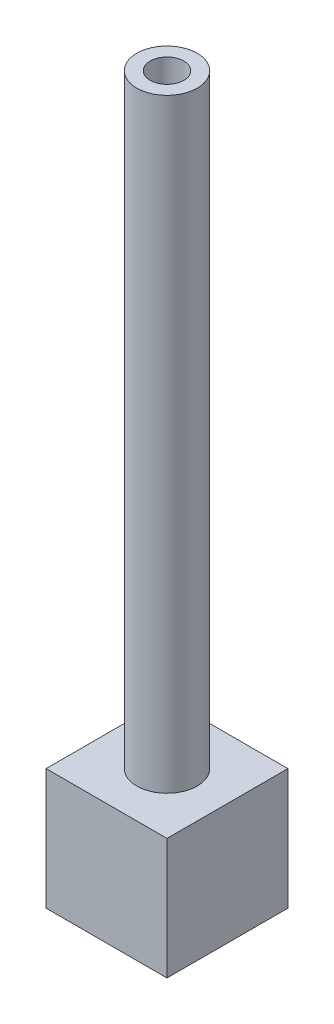
ISO-10303-21;
HEADER;
FILE_DESCRIPTION(('STEP AP214'),'2;1');
FILE_NAME('part.step','',(''),(''),'','','');
FILE_SCHEMA(('AUTOMOTIVE_DESIGN { 1 0 10303 214 1 1 1 1 }'));
ENDSEC;
DATA;
#1=APPLICATION_CONTEXT('core data for automotive mechanical design processes');
#2=APPLICATION_PROTOCOL_DEFINITION('international standard','automotive_design',2000,#1);
#3=PRODUCT_CONTEXT('',#1,'mechanical');
#4=PRODUCT('Part','Part','',(#3));
#5=PRODUCT_RELATED_PRODUCT_CATEGORY('part','',(#4));
#6=PRODUCT_DEFINITION_FORMATION('','',#4);
#7=PRODUCT_DEFINITION_CONTEXT('part definition',#1,'design');
#8=PRODUCT_DEFINITION('design','',#6,#7);
#9=PRODUCT_DEFINITION_SHAPE('','',#8);
#10=(LENGTH_UNIT() NAMED_UNIT(*) SI_UNIT(.MILLI.,.METRE.));
#11=(NAMED_UNIT(*) PLANE_ANGLE_UNIT() SI_UNIT($,.RADIAN.));
#12=(NAMED_UNIT(*) SI_UNIT($,.STERADIAN.) SOLID_ANGLE_UNIT());
#13=UNCERTAINTY_MEASURE_WITH_UNIT(LENGTH_MEASURE(1.E-05),#10,'distance_accuracy_value','');
#14=(GEOMETRIC_REPRESENTATION_CONTEXT(3) GLOBAL_UNCERTAINTY_ASSIGNED_CONTEXT((#13)) GLOBAL_UNIT_ASSIGNED_CONTEXT((#10,
#11,#12)) REPRESENTATION_CONTEXT('',''));
#15=CARTESIAN_POINT('',(0.,0.,0.));
#16=DIRECTION('',(0.,0.,1.));
#17=DIRECTION('',(1.,0.,0.));
#18=AXIS2_PLACEMENT_3D('',#15,#16,#17);
#19=CARTESIAN_POINT('',(0.,100.,0.));
#20=DIRECTION('',(0.,1.,0.));
#21=DIRECTION('',(0.,0.,1.));
#22=AXIS2_PLACEMENT_3D('',#19,#20,#21);
#23=PLANE('',#22);
#24=CARTESIAN_POINT('',(0.,100.,0.));
#25=DIRECTION('',(0.,1.,0.));
#26=DIRECTION('',(0.,0.,1.));
#27=AXIS2_PLACEMENT_3D('',#24,#25,#26);
#28=CIRCLE('',#27,5.);
#29=CARTESIAN_POINT('',(0.,100.,5.));
#30=VERTEX_POINT('',#29);
#31=EDGE_CURVE('E11',#30,#30,#28,.T.);
#32=ORIENTED_EDGE('',*,*,#31,.T.);
#33=EDGE_LOOP('',(#32));
#34=FACE_BOUND('',#33,.T.);
#35=CARTESIAN_POINT('',(0.,100.,0.));
#36=DIRECTION('',(0.,1.,0.));
#37=DIRECTION('',(0.,0.,1.));
#38=AXIS2_PLACEMENT_3D('',#35,#36,#37);
#39=CIRCLE('',#38,2.78);
#40=CARTESIAN_POINT('',(0.,100.,2.78));
#41=VERTEX_POINT('',#40);
#42=EDGE_CURVE('E45',#41,#41,#39,.T.);
#43=ORIENTED_EDGE('',*,*,#42,.F.);
#44=EDGE_LOOP('',(#43));
#45=FACE_BOUND('',#44,.T.);
#46=ADVANCED_FACE('F35',(#34,#45),#23,.T.);
#47=CARTESIAN_POINT('',(0.,100.,0.));
#48=DIRECTION('',(0.,-1.,0.));
#49=DIRECTION('',(0.,0.,-1.));
#50=AXIS2_PLACEMENT_3D('',#47,#48,#49);
#51=CYLINDRICAL_SURFACE('',#50,5.);
#52=ORIENTED_EDGE('',*,*,#31,.F.);
#53=EDGE_LOOP('',(#52));
#54=FACE_BOUND('',#53,.T.);
#55=CARTESIAN_POINT('',(0.,0.,0.));
#56=DIRECTION('',(0.,1.,0.));
#57=DIRECTION('',(0.,0.,1.));
#58=AXIS2_PLACEMENT_3D('',#55,#56,#57);
#59=CIRCLE('',#58,5.);
#60=CARTESIAN_POINT('',(0.,0.,5.));
#61=VERTEX_POINT('',#60);
#62=EDGE_CURVE('E39',#61,#61,#59,.T.);
#63=ORIENTED_EDGE('',*,*,#62,.T.);
#64=EDGE_LOOP('',(#63));
#65=FACE_BOUND('',#64,.T.);
#66=ADVANCED_FACE('F37',(#54,#65),#51,.T.);
#67=CARTESIAN_POINT('',(0.,100.,0.));
#68=DIRECTION('',(0.,-1.,0.));
#69=DIRECTION('',(0.,0.,-1.));
#70=AXIS2_PLACEMENT_3D('',#67,#68,#69);
#71=CYLINDRICAL_SURFACE('',#70,2.78);
#72=ORIENTED_EDGE('',*,*,#42,.T.);
#73=EDGE_LOOP('',(#72));
#74=FACE_BOUND('',#73,.T.);
#75=CARTESIAN_POINT('',(0.,0.,0.));
#76=DIRECTION('',(0.,1.,0.));
#77=DIRECTION('',(0.,0.,1.));
#78=AXIS2_PLACEMENT_3D('',#75,#76,#77);
#79=CIRCLE('',#78,2.78);
#80=CARTESIAN_POINT('',(0.,0.,2.78));
#81=VERTEX_POINT('',#80);
#82=EDGE_CURVE('E115',#81,#81,#79,.T.);
#83=ORIENTED_EDGE('',*,*,#82,.F.);
#84=EDGE_LOOP('',(#83));
#85=FACE_BOUND('',#84,.T.);
#86=ADVANCED_FACE('F145',(#74,#85),#71,.F.);
#87=CARTESIAN_POINT('',(0.,0.,0.));
#88=DIRECTION('',(0.,-1.,0.));
#89=DIRECTION('',(0.,0.,-1.));
#90=AXIS2_PLACEMENT_3D('',#87,#88,#89);
#91=PLANE('',#90);
#92=ORIENTED_EDGE('',*,*,#82,.T.);
#93=EDGE_LOOP('',(#92));
#94=FACE_BOUND('',#93,.T.);
#95=ADVANCED_FACE('F127',(#94),#91,.F.);
#96=CARTESIAN_POINT('',(-10.,-20.,-10.));
#97=DIRECTION('',(1.,0.,0.));
#98=DIRECTION('',(0.,0.,-1.));
#99=AXIS2_PLACEMENT_3D('',#96,#97,#98);
#100=PLANE('',#99);
#101=DIRECTION('',(0.,0.,-1.));
#102=VECTOR('',#101,1.);
#103=CARTESIAN_POINT('',(-10.,0.,-10.));
#104=LINE('',#103,#102);
#105=CARTESIAN_POINT('',(-10.,0.,10.));
#106=VERTEX_POINT('',#105);
#107=CARTESIAN_POINT('',(-10.,0.,-10.));
#108=VERTEX_POINT('',#107);
#109=EDGE_CURVE('E104',#106,#108,#104,.T.);
#110=ORIENTED_EDGE('',*,*,#109,.T.);
#111=DIRECTION('',(0.,1.,0.));
#112=VECTOR('',#111,1.);
#113=CARTESIAN_POINT('',(-10.,-20.,-10.));
#114=LINE('',#113,#112);
#115=CARTESIAN_POINT('',(-10.,-20.,-10.));
#116=VERTEX_POINT('',#115);
#117=EDGE_CURVE('E95',#116,#108,#114,.T.);
#118=ORIENTED_EDGE('',*,*,#117,.F.);
#119=DIRECTION('',(0.,0.,-1.));
#120=VECTOR('',#119,1.);
#121=CARTESIAN_POINT('',(-10.,-20.,-10.));
#122=LINE('',#121,#120);
#123=CARTESIAN_POINT('',(-10.,-20.,10.));
#124=VERTEX_POINT('',#123);
#125=EDGE_CURVE('E89',#124,#116,#122,.T.);
#126=ORIENTED_EDGE('',*,*,#125,.F.);
#127=DIRECTION('',(0.,1.,0.));
#128=VECTOR('',#127,1.);
#129=CARTESIAN_POINT('',(-10.,-20.,10.));
#130=LINE('',#129,#128);
#131=EDGE_CURVE('E100',#124,#106,#130,.T.);
#132=ORIENTED_EDGE('',*,*,#131,.T.);
#133=EDGE_LOOP('',(#110,#118,#126,#132));
#134=FACE_BOUND('',#133,.T.);
#135=ADVANCED_FACE('F130',(#134),#100,.F.);
#136=CARTESIAN_POINT('',(9.99999999999999,-20.,-10.));
#137=DIRECTION('',(0.,0.,1.));
#138=DIRECTION('',(1.,0.,0.));
#139=AXIS2_PLACEMENT_3D('',#136,#137,#138);
#140=PLANE('',#139);
#141=DIRECTION('',(1.,0.,0.));
#142=VECTOR('',#141,1.);
#143=CARTESIAN_POINT('',(9.99999999999999,0.,-10.));
#144=LINE('',#143,#142);
#145=CARTESIAN_POINT('',(9.99999999999999,0.,-10.));
#146=VERTEX_POINT('',#145);
#147=EDGE_CURVE('E94',#108,#146,#144,.T.);
#148=ORIENTED_EDGE('',*,*,#147,.T.);
#149=DIRECTION('',(0.,1.,0.));
#150=VECTOR('',#149,1.);
#151=CARTESIAN_POINT('',(9.99999999999999,-20.,-10.));
#152=LINE('',#151,#150);
#153=CARTESIAN_POINT('',(9.99999999999999,-20.,-10.));
#154=VERTEX_POINT('',#153);
#155=EDGE_CURVE('E92',#154,#146,#152,.T.);
#156=ORIENTED_EDGE('',*,*,#155,.F.);
#157=DIRECTION('',(1.,0.,0.));
#158=VECTOR('',#157,1.);
#159=CARTESIAN_POINT('',(9.99999999999999,-20.,-10.));
#160=LINE('',#159,#158);
#161=EDGE_CURVE('E84',#116,#154,#160,.T.);
#162=ORIENTED_EDGE('',*,*,#161,.F.);
#163=ORIENTED_EDGE('',*,*,#117,.T.);
#164=EDGE_LOOP('',(#148,#156,#162,#163));
#165=FACE_BOUND('',#164,.T.);
#166=ADVANCED_FACE('F93',(#165),#140,.F.);
#167=CARTESIAN_POINT('',(9.99999999999999,-20.,-10.));
#168=DIRECTION('',(-1.,0.,0.));
#169=DIRECTION('',(0.,0.,1.));
#170=AXIS2_PLACEMENT_3D('',#167,#168,#169);
#171=PLANE('',#170);
#172=DIRECTION('',(0.,0.,1.));
#173=VECTOR('',#172,1.);
#174=CARTESIAN_POINT('',(9.99999999999999,0.,-10.));
#175=LINE('',#174,#173);
#176=CARTESIAN_POINT('',(9.99999999999999,0.,10.));
#177=VERTEX_POINT('',#176);
#178=EDGE_CURVE('E70',#146,#177,#175,.T.);
#179=ORIENTED_EDGE('',*,*,#178,.T.);
#180=DIRECTION('',(0.,1.,0.));
#181=VECTOR('',#180,1.);
#182=CARTESIAN_POINT('',(9.99999999999999,-20.,10.));
#183=LINE('',#182,#181);
#184=CARTESIAN_POINT('',(9.99999999999999,-20.,10.));
#185=VERTEX_POINT('',#184);
#186=EDGE_CURVE('E96',#185,#177,#183,.T.);
#187=ORIENTED_EDGE('',*,*,#186,.F.);
#188=DIRECTION('',(0.,0.,1.));
#189=VECTOR('',#188,1.);
#190=CARTESIAN_POINT('',(9.99999999999999,-20.,-10.));
#191=LINE('',#190,#189);
#192=EDGE_CURVE('E87',#154,#185,#191,.T.);
#193=ORIENTED_EDGE('',*,*,#192,.F.);
#194=ORIENTED_EDGE('',*,*,#155,.T.);
#195=EDGE_LOOP('',(#179,#187,#193,#194));
#196=FACE_BOUND('',#195,.T.);
#197=ADVANCED_FACE('F98',(#196),#171,.F.);
#198=CARTESIAN_POINT('',(9.99999999999999,-20.,10.));
#199=DIRECTION('',(0.,0.,-1.));
#200=DIRECTION('',(-1.,0.,0.));
#201=AXIS2_PLACEMENT_3D('',#198,#199,#200);
#202=PLANE('',#201);
#203=DIRECTION('',(-1.,0.,0.));
#204=VECTOR('',#203,1.);
#205=CARTESIAN_POINT('',(9.99999999999999,0.,10.));
#206=LINE('',#205,#204);
#207=EDGE_CURVE('E76',#177,#106,#206,.T.);
#208=ORIENTED_EDGE('',*,*,#207,.T.);
#209=ORIENTED_EDGE('',*,*,#131,.F.);
#210=DIRECTION('',(-1.,0.,0.));
#211=VECTOR('',#210,1.);
#212=CARTESIAN_POINT('',(9.99999999999999,-20.,10.));
#213=LINE('',#212,#211);
#214=EDGE_CURVE('E53',#185,#124,#213,.T.);
#215=ORIENTED_EDGE('',*,*,#214,.F.);
#216=ORIENTED_EDGE('',*,*,#186,.T.);
#217=EDGE_LOOP('',(#208,#209,#215,#216));
#218=FACE_BOUND('',#217,.T.);
#219=ADVANCED_FACE('F131',(#218),#202,.F.);
#220=CARTESIAN_POINT('',(0.,-20.,0.));
#221=DIRECTION('',(0.,-1.,0.));
#222=DIRECTION('',(0.,0.,-1.));
#223=AXIS2_PLACEMENT_3D('',#220,#221,#222);
#224=PLANE('',#223);
#225=ORIENTED_EDGE('',*,*,#125,.T.);
#226=ORIENTED_EDGE('',*,*,#161,.T.);
#227=ORIENTED_EDGE('',*,*,#192,.T.);
#228=ORIENTED_EDGE('',*,*,#214,.T.);
#229=EDGE_LOOP('',(#225,#226,#227,#228));
#230=FACE_BOUND('',#229,.T.);
#231=ADVANCED_FACE('F85',(#230),#224,.T.);
#232=ORIENTED_EDGE('',*,*,#62,.F.);
#233=EDGE_LOOP('',(#232));
#234=FACE_BOUND('',#233,.T.);
#235=ORIENTED_EDGE('',*,*,#109,.F.);
#236=ORIENTED_EDGE('',*,*,#207,.F.);
#237=ORIENTED_EDGE('',*,*,#178,.F.);
#238=ORIENTED_EDGE('',*,*,#147,.F.);
#239=EDGE_LOOP('',(#235,#236,#237,#238));
#240=FACE_BOUND('',#239,.T.);
#241=ADVANCED_FACE('F123',(#234,#240),#91,.F.);
#242=CLOSED_SHELL('',(#46,#66,#86,#95,#135,#166,#197,#219,#231,#241));
#243=MANIFOLD_SOLID_BREP('B2',#242);
#244=ADVANCED_BREP_SHAPE_REPRESENTATION('',(#18,#243),#14);
#245=SHAPE_DEFINITION_REPRESENTATION(#9,#244);
ENDSEC;
END-ISO-10303-21;
